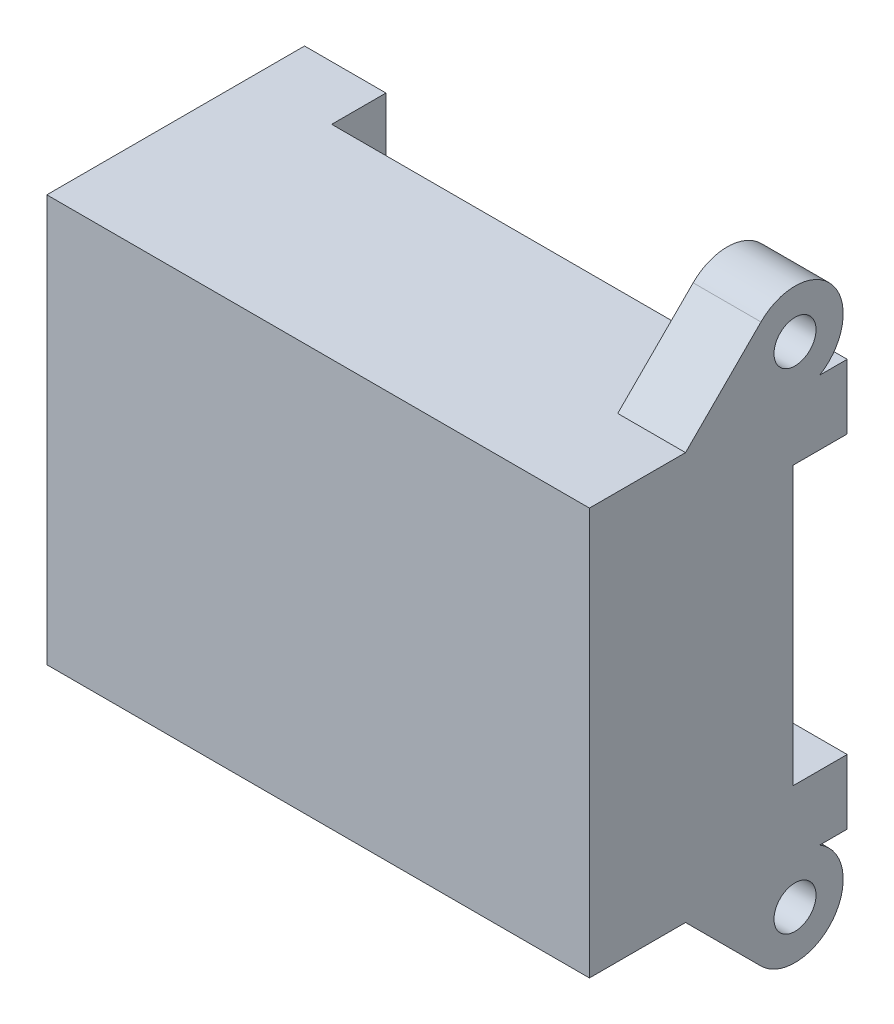
ISO-10303-21;
HEADER;
FILE_DESCRIPTION(('STEP AP214'),'2;1');
FILE_NAME('part.step','',(''),(''),'','','');
FILE_SCHEMA(('AUTOMOTIVE_DESIGN { 1 0 10303 214 1 1 1 1 }'));
ENDSEC;
DATA;
#1=APPLICATION_CONTEXT('core data for automotive mechanical design processes');
#2=APPLICATION_PROTOCOL_DEFINITION('international standard','automotive_design',2000,#1);
#3=PRODUCT_CONTEXT('',#1,'mechanical');
#4=PRODUCT('Part','Part','',(#3));
#5=PRODUCT_RELATED_PRODUCT_CATEGORY('part','',(#4));
#6=PRODUCT_DEFINITION_FORMATION('','',#4);
#7=PRODUCT_DEFINITION_CONTEXT('part definition',#1,'design');
#8=PRODUCT_DEFINITION('design','',#6,#7);
#9=PRODUCT_DEFINITION_SHAPE('','',#8);
#10=(LENGTH_UNIT() NAMED_UNIT(*) SI_UNIT(.MILLI.,.METRE.));
#11=(NAMED_UNIT(*) PLANE_ANGLE_UNIT() SI_UNIT($,.RADIAN.));
#12=(NAMED_UNIT(*) SI_UNIT($,.STERADIAN.) SOLID_ANGLE_UNIT());
#13=UNCERTAINTY_MEASURE_WITH_UNIT(LENGTH_MEASURE(1.E-05),#10,'distance_accuracy_value','');
#14=(GEOMETRIC_REPRESENTATION_CONTEXT(3) GLOBAL_UNCERTAINTY_ASSIGNED_CONTEXT((#13)) GLOBAL_UNIT_ASSIGNED_CONTEXT((#10,
#11,#12)) REPRESENTATION_CONTEXT('',''));
#15=CARTESIAN_POINT('',(0.,0.,0.));
#16=DIRECTION('',(0.,0.,1.));
#17=DIRECTION('',(1.,0.,0.));
#18=AXIS2_PLACEMENT_3D('',#15,#16,#17);
#19=CARTESIAN_POINT('',(-87.5999999999999,0.500000000000004,-14.9999999999999));
#20=DIRECTION('',(0.,0.,-1.));
#21=DIRECTION('',(0.,1.,0.));
#22=AXIS2_PLACEMENT_3D('',#19,#20,#21);
#23=PLANE('',#22);
#24=DIRECTION('',(1.,0.,0.));
#25=VECTOR('',#24,1.);
#26=CARTESIAN_POINT('',(-44.15,-9.73000000000001,-14.9999999999999));
#27=LINE('',#26,#25);
#28=CARTESIAN_POINT('',(-50.15,-9.73000000000001,-14.9999999999999));
#29=VERTEX_POINT('',#28);
#30=CARTESIAN_POINT('',(-44.15,-9.73000000000001,-14.9999999999999));
#31=VERTEX_POINT('',#30);
#32=EDGE_CURVE('E54',#29,#31,#27,.T.);
#33=ORIENTED_EDGE('',*,*,#32,.F.);
#34=DIRECTION('',(0.,1.,0.));
#35=VECTOR('',#34,1.);
#36=CARTESIAN_POINT('',(-50.15,-9.73000000000001,-14.9999999999999));
#37=LINE('',#36,#35);
#38=CARTESIAN_POINT('',(-50.15,-14.5,-14.9999999999999));
#39=VERTEX_POINT('',#38);
#40=EDGE_CURVE('E58',#39,#29,#37,.T.);
#41=ORIENTED_EDGE('',*,*,#40,.F.);
#42=DIRECTION('',(1.,0.,0.));
#43=VECTOR('',#42,1.);
#44=CARTESIAN_POINT('',(-84.15,-14.5,-14.9999999999999));
#45=LINE('',#44,#43);
#46=CARTESIAN_POINT('',(-78.15,-14.5,-14.9999999999999));
#47=VERTEX_POINT('',#46);
#48=EDGE_CURVE('E394',#47,#39,#45,.T.);
#49=ORIENTED_EDGE('',*,*,#48,.F.);
#50=DIRECTION('',(0.,-1.,0.));
#51=VECTOR('',#50,1.);
#52=CARTESIAN_POINT('',(-78.15,-14.5,-14.9999999999999));
#53=LINE('',#52,#51);
#54=CARTESIAN_POINT('',(-78.15,-9.73,-14.9999999999999));
#55=VERTEX_POINT('',#54);
#56=EDGE_CURVE('E231',#55,#47,#53,.T.);
#57=ORIENTED_EDGE('',*,*,#56,.F.);
#58=DIRECTION('',(1.,0.,0.));
#59=VECTOR('',#58,1.);
#60=CARTESIAN_POINT('',(-84.15,-9.73,-14.9999999999999));
#61=LINE('',#60,#59);
#62=CARTESIAN_POINT('',(-84.15,-9.73,-14.9999999999999));
#63=VERTEX_POINT('',#62);
#64=EDGE_CURVE('E220',#63,#55,#61,.T.);
#65=ORIENTED_EDGE('',*,*,#64,.F.);
#66=DIRECTION('',(0.,-1.,0.));
#67=VECTOR('',#66,1.);
#68=CARTESIAN_POINT('',(-84.15,15.5,-14.9999999999999));
#69=LINE('',#68,#67);
#70=CARTESIAN_POINT('',(-84.15,10.73,-14.9999999999999));
#71=VERTEX_POINT('',#70);
#72=EDGE_CURVE('E47',#71,#63,#69,.T.);
#73=ORIENTED_EDGE('',*,*,#72,.F.);
#74=DIRECTION('',(-1.,0.,0.));
#75=VECTOR('',#74,1.);
#76=CARTESIAN_POINT('',(-84.15,10.73,-14.9999999999999));
#77=LINE('',#76,#75);
#78=CARTESIAN_POINT('',(-78.15,10.73,-14.9999999999999));
#79=VERTEX_POINT('',#78);
#80=EDGE_CURVE('E262',#79,#71,#77,.T.);
#81=ORIENTED_EDGE('',*,*,#80,.F.);
#82=DIRECTION('',(0.,-1.,0.));
#83=VECTOR('',#82,1.);
#84=CARTESIAN_POINT('',(-78.15,15.5,-14.9999999999999));
#85=LINE('',#84,#83);
#86=CARTESIAN_POINT('',(-78.15,15.5,-14.9999999999999));
#87=VERTEX_POINT('',#86);
#88=EDGE_CURVE('E256',#87,#79,#85,.T.);
#89=ORIENTED_EDGE('',*,*,#88,.F.);
#90=DIRECTION('',(-1.,0.,0.));
#91=VECTOR('',#90,1.);
#92=CARTESIAN_POINT('',(-84.15,15.5,-14.9999999999999));
#93=LINE('',#92,#91);
#94=CARTESIAN_POINT('',(-50.15,15.5,-14.9999999999999));
#95=VERTEX_POINT('',#94);
#96=EDGE_CURVE('E413',#95,#87,#93,.T.);
#97=ORIENTED_EDGE('',*,*,#96,.F.);
#98=DIRECTION('',(0.,1.,0.));
#99=VECTOR('',#98,1.);
#100=CARTESIAN_POINT('',(-50.15,10.73,-14.9999999999999));
#101=LINE('',#100,#99);
#102=CARTESIAN_POINT('',(-50.15,10.73,-14.9999999999999));
#103=VERTEX_POINT('',#102);
#104=EDGE_CURVE('E292',#103,#95,#101,.T.);
#105=ORIENTED_EDGE('',*,*,#104,.F.);
#106=DIRECTION('',(-1.,0.,0.));
#107=VECTOR('',#106,1.);
#108=CARTESIAN_POINT('',(-44.15,10.73,-14.9999999999999));
#109=LINE('',#108,#107);
#110=CARTESIAN_POINT('',(-44.15,10.73,-14.9999999999999));
#111=VERTEX_POINT('',#110);
#112=EDGE_CURVE('E286',#111,#103,#109,.T.);
#113=ORIENTED_EDGE('',*,*,#112,.F.);
#114=DIRECTION('',(0.,1.,0.));
#115=VECTOR('',#114,1.);
#116=CARTESIAN_POINT('',(-44.15,15.5,-14.9999999999999));
#117=LINE('',#116,#115);
#118=EDGE_CURVE('E418',#31,#111,#117,.T.);
#119=ORIENTED_EDGE('',*,*,#118,.F.);
#120=EDGE_LOOP('',(#33,#41,#49,#57,#65,#73,#81,#89,#97,#105,#113,#119));
#121=FACE_BOUND('',#120,.T.);
#122=ADVANCED_FACE('F39',(#121),#23,.T.);
#123=CARTESIAN_POINT('',(-49.15,-17.55,-15.1549999999999));
#124=DIRECTION('',(1.,0.,0.));
#125=DIRECTION('',(0.,0.,-1.));
#126=AXIS2_PLACEMENT_3D('',#123,#124,#125);
#127=CYLINDRICAL_SURFACE('',#126,3.55);
#128=DIRECTION('',(1.,0.,0.));
#129=VECTOR('',#128,1.);
#130=CARTESIAN_POINT('',(-49.15,-14.5,-16.9715902124584));
#131=LINE('',#130,#129);
#132=CARTESIAN_POINT('',(-44.15,-14.5,-16.9715902124584));
#133=VERTEX_POINT('',#132);
#134=CARTESIAN_POINT('',(-49.15,-14.5,-16.9715902124584));
#135=VERTEX_POINT('',#134);
#136=EDGE_CURVE('E216',#133,#135,#131,.F.);
#137=ORIENTED_EDGE('',*,*,#136,.F.);
#138=CARTESIAN_POINT('',(-44.15,-17.55,-15.1549999999999));
#139=DIRECTION('',(-1.,0.,0.));
#140=DIRECTION('',(0.,0.,-1.));
#141=AXIS2_PLACEMENT_3D('',#138,#139,#140);
#142=CIRCLE('',#141,3.55);
#143=CARTESIAN_POINT('',(-44.15,-20.0602290732122,-12.6447709267876));
#144=VERTEX_POINT('',#143);
#145=EDGE_CURVE('E214',#133,#144,#142,.T.);
#146=ORIENTED_EDGE('',*,*,#145,.T.);
#147=DIRECTION('',(1.,0.,0.));
#148=VECTOR('',#147,1.);
#149=CARTESIAN_POINT('',(-49.15,-20.0602290732122,-12.6447709267876));
#150=LINE('',#149,#148);
#151=CARTESIAN_POINT('',(-49.15,-20.0602290732122,-12.6447709267876));
#152=VERTEX_POINT('',#151);
#153=EDGE_CURVE('E350',#152,#144,#150,.T.);
#154=ORIENTED_EDGE('',*,*,#153,.F.);
#155=CARTESIAN_POINT('',(-49.15,-17.55,-15.1549999999999));
#156=DIRECTION('',(-1.,0.,0.));
#157=DIRECTION('',(0.,0.,-1.));
#158=AXIS2_PLACEMENT_3D('',#155,#156,#157);
#159=CIRCLE('',#158,3.55);
#160=EDGE_CURVE('E335',#135,#152,#159,.T.);
#161=ORIENTED_EDGE('',*,*,#160,.F.);
#162=EDGE_LOOP('',(#137,#146,#154,#161));
#163=FACE_BOUND('',#162,.T.);
#164=ADVANCED_FACE('F504',(#163),#127,.T.);
#165=CARTESIAN_POINT('',(-49.15,1.00000000000005,0.));
#166=DIRECTION('',(1.,0.,0.));
#167=DIRECTION('',(0.,0.,-1.));
#168=AXIS2_PLACEMENT_3D('',#165,#166,#167);
#169=PLANE('',#168);
#170=CARTESIAN_POINT('',(-49.15,-17.55,-15.1549999999999));
#171=DIRECTION('',(-1.,0.,0.));
#172=DIRECTION('',(0.,0.,-1.));
#173=AXIS2_PLACEMENT_3D('',#170,#171,#172);
#174=CIRCLE('',#173,1.55);
#175=CARTESIAN_POINT('',(-49.15,-17.55,-16.7049999999999));
#176=VERTEX_POINT('',#175);
#177=EDGE_CURVE('E338',#176,#176,#174,.T.);
#178=ORIENTED_EDGE('',*,*,#177,.F.);
#179=EDGE_LOOP('',(#178));
#180=FACE_BOUND('',#179,.T.);
#181=DIRECTION('',(0.,0.,1.));
#182=VECTOR('',#181,1.);
#183=CARTESIAN_POINT('',(-49.15,-14.5,0.));
#184=LINE('',#183,#182);
#185=CARTESIAN_POINT('',(-49.15,-14.5,-7.08454185357544));
#186=VERTEX_POINT('',#185);
#187=EDGE_CURVE('E328',#135,#186,#184,.T.);
#188=ORIENTED_EDGE('',*,*,#187,.F.);
#189=ORIENTED_EDGE('',*,*,#160,.T.);
#190=DIRECTION('',(0.,0.707106781186549,0.707106781186546));
#191=VECTOR('',#190,1.);
#192=CARTESIAN_POINT('',(-49.15,-3.20772907321222,4.20772907321228));
#193=LINE('',#192,#191);
#194=EDGE_CURVE('E331',#152,#186,#193,.T.);
#195=ORIENTED_EDGE('',*,*,#194,.T.);
#196=EDGE_LOOP('',(#188,#189,#195));
#197=FACE_BOUND('',#196,.T.);
#198=ADVANCED_FACE('F509',(#180,#197),#169,.F.);
#199=CARTESIAN_POINT('',(-49.15,18.55,-15.1549999999999));
#200=DIRECTION('',(1.,0.,0.));
#201=DIRECTION('',(0.,0.,-1.));
#202=AXIS2_PLACEMENT_3D('',#199,#200,#201);
#203=CYLINDRICAL_SURFACE('',#202,3.55);
#204=CARTESIAN_POINT('',(-44.15,18.55,-15.1549999999999));
#205=DIRECTION('',(1.,0.,0.));
#206=DIRECTION('',(0.,0.,-1.));
#207=AXIS2_PLACEMENT_3D('',#204,#205,#206);
#208=CIRCLE('',#207,3.55);
#209=CARTESIAN_POINT('',(-44.15,15.5,-16.9715902124584));
#210=VERTEX_POINT('',#209);
#211=CARTESIAN_POINT('',(-44.15,21.0602290732123,-12.6447709267876));
#212=VERTEX_POINT('',#211);
#213=EDGE_CURVE('E354',#210,#212,#208,.T.);
#214=ORIENTED_EDGE('',*,*,#213,.F.);
#215=DIRECTION('',(1.,0.,0.));
#216=VECTOR('',#215,1.);
#217=CARTESIAN_POINT('',(-49.15,15.5,-16.9715902124584));
#218=LINE('',#217,#216);
#219=CARTESIAN_POINT('',(-49.15,15.5,-16.9715902124584));
#220=VERTEX_POINT('',#219);
#221=EDGE_CURVE('E323',#210,#220,#218,.F.);
#222=ORIENTED_EDGE('',*,*,#221,.T.);
#223=CARTESIAN_POINT('',(-49.15,18.55,-15.1549999999999));
#224=DIRECTION('',(1.,0.,0.));
#225=DIRECTION('',(0.,0.,-1.));
#226=AXIS2_PLACEMENT_3D('',#223,#224,#225);
#227=CIRCLE('',#226,3.55);
#228=CARTESIAN_POINT('',(-49.15,21.0602290732123,-12.6447709267876));
#229=VERTEX_POINT('',#228);
#230=EDGE_CURVE('E361',#220,#229,#227,.T.);
#231=ORIENTED_EDGE('',*,*,#230,.T.);
#232=DIRECTION('',(1.,0.,0.));
#233=VECTOR('',#232,1.);
#234=CARTESIAN_POINT('',(-49.15,21.0602290732123,-12.6447709267876));
#235=LINE('',#234,#233);
#236=EDGE_CURVE('E373',#229,#212,#235,.T.);
#237=ORIENTED_EDGE('',*,*,#236,.T.);
#238=EDGE_LOOP('',(#214,#222,#231,#237));
#239=FACE_BOUND('',#238,.T.);
#240=ADVANCED_FACE('F515',(#239),#203,.T.);
#241=CARTESIAN_POINT('',(-49.15,0.,0.));
#242=DIRECTION('',(1.,0.,0.));
#243=DIRECTION('',(0.,0.,-1.));
#244=AXIS2_PLACEMENT_3D('',#241,#242,#243);
#245=PLANE('',#244);
#246=CARTESIAN_POINT('',(-49.15,18.55,-15.1549999999999));
#247=DIRECTION('',(1.,0.,0.));
#248=DIRECTION('',(0.,0.,-1.));
#249=AXIS2_PLACEMENT_3D('',#246,#247,#248);
#250=CIRCLE('',#249,1.55);
#251=CARTESIAN_POINT('',(-49.15,18.55,-16.7049999999999));
#252=VERTEX_POINT('',#251);
#253=EDGE_CURVE('E369',#252,#252,#250,.T.);
#254=ORIENTED_EDGE('',*,*,#253,.T.);
#255=EDGE_LOOP('',(#254));
#256=FACE_BOUND('',#255,.T.);
#257=ORIENTED_EDGE('',*,*,#230,.F.);
#258=DIRECTION('',(0.,0.,1.));
#259=VECTOR('',#258,1.);
#260=CARTESIAN_POINT('',(-49.15,15.5,0.));
#261=LINE('',#260,#259);
#262=CARTESIAN_POINT('',(-49.15,15.5,-7.08454185357544));
#263=VERTEX_POINT('',#262);
#264=EDGE_CURVE('E358',#220,#263,#261,.T.);
#265=ORIENTED_EDGE('',*,*,#264,.T.);
#266=DIRECTION('',(0.,-0.707106781186549,0.707106781186546));
#267=VECTOR('',#266,1.);
#268=CARTESIAN_POINT('',(-49.15,4.20772907321226,4.20772907321228));
#269=LINE('',#268,#267);
#270=EDGE_CURVE('E365',#229,#263,#269,.T.);
#271=ORIENTED_EDGE('',*,*,#270,.F.);
#272=EDGE_LOOP('',(#257,#265,#271));
#273=FACE_BOUND('',#272,.T.);
#274=ADVANCED_FACE('F526',(#256,#273),#245,.F.);
#275=CARTESIAN_POINT('',(-84.15,-14.5,-64.9999999999999));
#276=DIRECTION('',(0.,-1.,0.));
#277=DIRECTION('',(1.,0.,0.));
#278=AXIS2_PLACEMENT_3D('',#275,#276,#277);
#279=PLANE('',#278);
#280=ORIENTED_EDGE('',*,*,#187,.T.);
#281=DIRECTION('',(1.,0.,0.));
#282=VECTOR('',#281,1.);
#283=CARTESIAN_POINT('',(-49.15,-14.5,-7.08454185357544));
#284=LINE('',#283,#282);
#285=CARTESIAN_POINT('',(-44.15,-14.5,-7.08454185357544));
#286=VERTEX_POINT('',#285);
#287=EDGE_CURVE('E342',#186,#286,#284,.T.);
#288=ORIENTED_EDGE('',*,*,#287,.T.);
#289=DIRECTION('',(0.,0.,1.));
#290=VECTOR('',#289,1.);
#291=CARTESIAN_POINT('',(-44.15,-14.5,-64.9999999999999));
#292=LINE('',#291,#290);
#293=CARTESIAN_POINT('',(-44.15,-14.5,0.));
#294=VERTEX_POINT('',#293);
#295=EDGE_CURVE('E408',#286,#294,#292,.T.);
#296=ORIENTED_EDGE('',*,*,#295,.T.);
#297=DIRECTION('',(1.,0.,0.));
#298=VECTOR('',#297,1.);
#299=CARTESIAN_POINT('',(-84.15,-14.5,0.));
#300=LINE('',#299,#298);
#301=CARTESIAN_POINT('',(-84.15,-14.5,0.));
#302=VERTEX_POINT('',#301);
#303=EDGE_CURVE('E399',#302,#294,#300,.T.);
#304=ORIENTED_EDGE('',*,*,#303,.F.);
#305=DIRECTION('',(0.,0.,1.));
#306=VECTOR('',#305,1.);
#307=CARTESIAN_POINT('',(-84.15,-14.5,-64.9999999999999));
#308=LINE('',#307,#306);
#309=CARTESIAN_POINT('',(-84.15,-14.5,-18.9999999999999));
#310=VERTEX_POINT('',#309);
#311=EDGE_CURVE('E11',#310,#302,#308,.T.);
#312=ORIENTED_EDGE('',*,*,#311,.F.);
#313=DIRECTION('',(-1.,0.,0.));
#314=VECTOR('',#313,1.);
#315=CARTESIAN_POINT('',(-84.15,-14.5,-18.9999999999999));
#316=LINE('',#315,#314);
#317=CARTESIAN_POINT('',(-78.15,-14.5,-18.9999999999999));
#318=VERTEX_POINT('',#317);
#319=EDGE_CURVE('E237',#318,#310,#316,.T.);
#320=ORIENTED_EDGE('',*,*,#319,.F.);
#321=DIRECTION('',(0.,0.,1.));
#322=VECTOR('',#321,1.);
#323=CARTESIAN_POINT('',(-78.15,-14.5,-18.9999999999999));
#324=LINE('',#323,#322);
#325=EDGE_CURVE('E241',#318,#47,#324,.T.);
#326=ORIENTED_EDGE('',*,*,#325,.T.);
#327=ORIENTED_EDGE('',*,*,#48,.T.);
#328=DIRECTION('',(0.,0.,1.));
#329=VECTOR('',#328,1.);
#330=CARTESIAN_POINT('',(-50.15,-14.5,-18.9999999999999));
#331=LINE('',#330,#329);
#332=CARTESIAN_POINT('',(-50.15,-14.5,-18.9999999999999));
#333=VERTEX_POINT('',#332);
#334=EDGE_CURVE('E194',#333,#39,#331,.T.);
#335=ORIENTED_EDGE('',*,*,#334,.F.);
#336=DIRECTION('',(-1.,0.,0.));
#337=VECTOR('',#336,1.);
#338=CARTESIAN_POINT('',(-44.15,-14.5,-18.9999999999999));
#339=LINE('',#338,#337);
#340=CARTESIAN_POINT('',(-44.15,-14.5,-18.9999999999999));
#341=VERTEX_POINT('',#340);
#342=EDGE_CURVE('E186',#341,#333,#339,.T.);
#343=ORIENTED_EDGE('',*,*,#342,.F.);
#344=DIRECTION('',(0.,0.,1.));
#345=VECTOR('',#344,1.);
#346=CARTESIAN_POINT('',(-44.15,-14.5,-18.9999999999999));
#347=LINE('',#346,#345);
#348=EDGE_CURVE('E192',#341,#133,#347,.T.);
#349=ORIENTED_EDGE('',*,*,#348,.T.);
#350=ORIENTED_EDGE('',*,*,#136,.T.);
#351=EDGE_LOOP('',(#280,#288,#296,#304,#312,#320,#326,#327,#335,#343,#349,#350));
#352=FACE_BOUND('',#351,.T.);
#353=ADVANCED_FACE('F189',(#352),#279,.T.);
#354=CARTESIAN_POINT('',(0.,0.,0.));
#355=DIRECTION('',(0.,0.,1.));
#356=DIRECTION('',(1.,0.,0.));
#357=AXIS2_PLACEMENT_3D('',#354,#355,#356);
#358=PLANE('',#357);
#359=DIRECTION('',(0.,-1.,0.));
#360=VECTOR('',#359,1.);
#361=CARTESIAN_POINT('',(-84.15,15.5,0.));
#362=LINE('',#361,#360);
#363=CARTESIAN_POINT('',(-84.15,15.5,0.));
#364=VERTEX_POINT('',#363);
#365=EDGE_CURVE('E386',#364,#302,#362,.T.);
#366=ORIENTED_EDGE('',*,*,#365,.T.);
#367=ORIENTED_EDGE('',*,*,#303,.T.);
#368=DIRECTION('',(0.,1.,0.));
#369=VECTOR('',#368,1.);
#370=CARTESIAN_POINT('',(-44.15,15.5,0.));
#371=LINE('',#370,#369);
#372=CARTESIAN_POINT('',(-44.15,15.5,0.));
#373=VERTEX_POINT('',#372);
#374=EDGE_CURVE('E395',#294,#373,#371,.T.);
#375=ORIENTED_EDGE('',*,*,#374,.T.);
#376=DIRECTION('',(-1.,0.,0.));
#377=VECTOR('',#376,1.);
#378=CARTESIAN_POINT('',(-84.15,15.5,0.));
#379=LINE('',#378,#377);
#380=EDGE_CURVE('E390',#373,#364,#379,.T.);
#381=ORIENTED_EDGE('',*,*,#380,.T.);
#382=EDGE_LOOP('',(#366,#367,#375,#381));
#383=FACE_BOUND('',#382,.T.);
#384=ADVANCED_FACE('F432',(#383),#358,.T.);
#385=CARTESIAN_POINT('',(-44.15,15.5,-64.9999999999999));
#386=DIRECTION('',(1.,0.,0.));
#387=DIRECTION('',(0.,0.,-1.));
#388=AXIS2_PLACEMENT_3D('',#385,#386,#387);
#389=PLANE('',#388);
#390=ORIENTED_EDGE('',*,*,#145,.F.);
#391=ORIENTED_EDGE('',*,*,#348,.F.);
#392=DIRECTION('',(0.,-1.,0.));
#393=VECTOR('',#392,1.);
#394=CARTESIAN_POINT('',(-44.15,-9.73000000000001,-18.9999999999999));
#395=LINE('',#394,#393);
#396=CARTESIAN_POINT('',(-44.15,-9.73000000000001,-18.9999999999999));
#397=VERTEX_POINT('',#396);
#398=EDGE_CURVE('E199',#397,#341,#395,.T.);
#399=ORIENTED_EDGE('',*,*,#398,.F.);
#400=DIRECTION('',(0.,0.,1.));
#401=VECTOR('',#400,1.);
#402=CARTESIAN_POINT('',(-44.15,-9.73000000000001,-18.9999999999999));
#403=LINE('',#402,#401);
#404=EDGE_CURVE('E477',#397,#31,#403,.T.);
#405=ORIENTED_EDGE('',*,*,#404,.T.);
#406=ORIENTED_EDGE('',*,*,#118,.T.);
#407=DIRECTION('',(0.,0.,1.));
#408=VECTOR('',#407,1.);
#409=CARTESIAN_POINT('',(-44.15,10.73,-18.9999999999999));
#410=LINE('',#409,#408);
#411=CARTESIAN_POINT('',(-44.15,10.73,-18.9999999999999));
#412=VERTEX_POINT('',#411);
#413=EDGE_CURVE('E319',#412,#111,#410,.T.);
#414=ORIENTED_EDGE('',*,*,#413,.F.);
#415=DIRECTION('',(0.,-1.,0.));
#416=VECTOR('',#415,1.);
#417=CARTESIAN_POINT('',(-44.15,10.73,-18.9999999999999));
#418=LINE('',#417,#416);
#419=CARTESIAN_POINT('',(-44.15,15.5,-18.9999999999999));
#420=VERTEX_POINT('',#419);
#421=EDGE_CURVE('E287',#420,#412,#418,.T.);
#422=ORIENTED_EDGE('',*,*,#421,.F.);
#423=DIRECTION('',(0.,0.,1.));
#424=VECTOR('',#423,1.);
#425=CARTESIAN_POINT('',(-44.15,15.5,-18.9999999999999));
#426=LINE('',#425,#424);
#427=EDGE_CURVE('E301',#420,#210,#426,.T.);
#428=ORIENTED_EDGE('',*,*,#427,.T.);
#429=ORIENTED_EDGE('',*,*,#213,.T.);
#430=DIRECTION('',(0.,-0.707106781186549,0.707106781186546));
#431=VECTOR('',#430,1.);
#432=CARTESIAN_POINT('',(-44.15,4.20772907321226,4.20772907321228));
#433=LINE('',#432,#431);
#434=CARTESIAN_POINT('',(-44.15,15.5,-7.08454185357544));
#435=VERTEX_POINT('',#434);
#436=EDGE_CURVE('E376',#212,#435,#433,.T.);
#437=ORIENTED_EDGE('',*,*,#436,.T.);
#438=DIRECTION('',(0.,0.,1.));
#439=VECTOR('',#438,1.);
#440=CARTESIAN_POINT('',(-44.15,15.5,-64.9999999999999));
#441=LINE('',#440,#439);
#442=EDGE_CURVE('E417',#435,#373,#441,.T.);
#443=ORIENTED_EDGE('',*,*,#442,.T.);
#444=ORIENTED_EDGE('',*,*,#374,.F.);
#445=ORIENTED_EDGE('',*,*,#295,.F.);
#446=DIRECTION('',(0.,0.707106781186549,0.707106781186546));
#447=VECTOR('',#446,1.);
#448=CARTESIAN_POINT('',(-44.15,-3.20772907321222,4.20772907321228));
#449=LINE('',#448,#447);
#450=EDGE_CURVE('E327',#144,#286,#449,.T.);
#451=ORIENTED_EDGE('',*,*,#450,.F.);
#452=EDGE_LOOP('',(#390,#391,#399,#405,#406,#414,#422,#428,#429,#437,#443,#444,#445,#451));
#453=FACE_BOUND('',#452,.T.);
#454=CARTESIAN_POINT('',(-44.15,18.55,-15.1549999999999));
#455=DIRECTION('',(1.,0.,0.));
#456=DIRECTION('',(0.,0.,-1.));
#457=AXIS2_PLACEMENT_3D('',#454,#455,#456);
#458=CIRCLE('',#457,1.55);
#459=CARTESIAN_POINT('',(-44.15,18.55,-16.7049999999999));
#460=VERTEX_POINT('',#459);
#461=EDGE_CURVE('E362',#460,#460,#458,.T.);
#462=ORIENTED_EDGE('',*,*,#461,.F.);
#463=EDGE_LOOP('',(#462));
#464=FACE_BOUND('',#463,.T.);
#465=CARTESIAN_POINT('',(-44.15,-17.55,-15.1549999999999));
#466=DIRECTION('',(-1.,0.,0.));
#467=DIRECTION('',(0.,0.,-1.));
#468=AXIS2_PLACEMENT_3D('',#465,#466,#467);
#469=CIRCLE('',#468,1.55);
#470=CARTESIAN_POINT('',(-44.15,-17.55,-16.7049999999999));
#471=VERTEX_POINT('',#470);
#472=EDGE_CURVE('E332',#471,#471,#469,.T.);
#473=ORIENTED_EDGE('',*,*,#472,.T.);
#474=EDGE_LOOP('',(#473));
#475=FACE_BOUND('',#474,.T.);
#476=ADVANCED_FACE('F211',(#453,#464,#475),#389,.T.);
#477=CARTESIAN_POINT('',(-84.15,15.5,-64.9999999999999));
#478=DIRECTION('',(0.,1.,0.));
#479=DIRECTION('',(-1.,0.,0.));
#480=AXIS2_PLACEMENT_3D('',#477,#478,#479);
#481=PLANE('',#480);
#482=DIRECTION('',(1.,0.,0.));
#483=VECTOR('',#482,1.);
#484=CARTESIAN_POINT('',(-49.15,15.5,-7.08454185357544));
#485=LINE('',#484,#483);
#486=EDGE_CURVE('E382',#263,#435,#485,.T.);
#487=ORIENTED_EDGE('',*,*,#486,.F.);
#488=ORIENTED_EDGE('',*,*,#264,.F.);
#489=ORIENTED_EDGE('',*,*,#221,.F.);
#490=ORIENTED_EDGE('',*,*,#427,.F.);
#491=DIRECTION('',(1.,0.,0.));
#492=VECTOR('',#491,1.);
#493=CARTESIAN_POINT('',(-44.15,15.5,-18.9999999999999));
#494=LINE('',#493,#492);
#495=CARTESIAN_POINT('',(-50.15,15.5,-18.9999999999999));
#496=VERTEX_POINT('',#495);
#497=EDGE_CURVE('E298',#496,#420,#494,.T.);
#498=ORIENTED_EDGE('',*,*,#497,.F.);
#499=DIRECTION('',(0.,0.,1.));
#500=VECTOR('',#499,1.);
#501=CARTESIAN_POINT('',(-50.15,15.5,-18.9999999999999));
#502=LINE('',#501,#500);
#503=EDGE_CURVE('E311',#496,#95,#502,.T.);
#504=ORIENTED_EDGE('',*,*,#503,.T.);
#505=ORIENTED_EDGE('',*,*,#96,.T.);
#506=DIRECTION('',(0.,0.,1.));
#507=VECTOR('',#506,1.);
#508=CARTESIAN_POINT('',(-78.15,15.5,-18.9999999999999));
#509=LINE('',#508,#507);
#510=CARTESIAN_POINT('',(-78.15,15.5,-18.9999999999999));
#511=VERTEX_POINT('',#510);
#512=EDGE_CURVE('E283',#511,#87,#509,.T.);
#513=ORIENTED_EDGE('',*,*,#512,.F.);
#514=DIRECTION('',(1.,0.,0.));
#515=VECTOR('',#514,1.);
#516=CARTESIAN_POINT('',(-84.15,15.5,-18.9999999999999));
#517=LINE('',#516,#515);
#518=CARTESIAN_POINT('',(-84.15,15.5,-18.9999999999999));
#519=VERTEX_POINT('',#518);
#520=EDGE_CURVE('E261',#519,#511,#517,.T.);
#521=ORIENTED_EDGE('',*,*,#520,.F.);
#522=DIRECTION('',(0.,0.,1.));
#523=VECTOR('',#522,1.);
#524=CARTESIAN_POINT('',(-84.15,15.5,-64.9999999999999));
#525=LINE('',#524,#523);
#526=EDGE_CURVE('E412',#519,#364,#525,.T.);
#527=ORIENTED_EDGE('',*,*,#526,.T.);
#528=ORIENTED_EDGE('',*,*,#380,.F.);
#529=ORIENTED_EDGE('',*,*,#442,.F.);
#530=EDGE_LOOP('',(#487,#488,#489,#490,#498,#504,#505,#513,#521,#527,#528,#529));
#531=FACE_BOUND('',#530,.T.);
#532=ADVANCED_FACE('F463',(#531),#481,.T.);
#533=CARTESIAN_POINT('',(-84.15,15.5,-64.9999999999999));
#534=DIRECTION('',(-1.,0.,0.));
#535=DIRECTION('',(0.,0.,1.));
#536=AXIS2_PLACEMENT_3D('',#533,#534,#535);
#537=PLANE('',#536);
#538=ORIENTED_EDGE('',*,*,#526,.F.);
#539=DIRECTION('',(0.,1.,0.));
#540=VECTOR('',#539,1.);
#541=CARTESIAN_POINT('',(-84.15,15.5,-18.9999999999999));
#542=LINE('',#541,#540);
#543=CARTESIAN_POINT('',(-84.15,10.73,-18.9999999999999));
#544=VERTEX_POINT('',#543);
#545=EDGE_CURVE('E257',#544,#519,#542,.T.);
#546=ORIENTED_EDGE('',*,*,#545,.F.);
#547=DIRECTION('',(0.,0.,1.));
#548=VECTOR('',#547,1.);
#549=CARTESIAN_POINT('',(-84.15,10.73,-18.9999999999999));
#550=LINE('',#549,#548);
#551=EDGE_CURVE('E271',#544,#71,#550,.T.);
#552=ORIENTED_EDGE('',*,*,#551,.T.);
#553=ORIENTED_EDGE('',*,*,#72,.T.);
#554=DIRECTION('',(0.,0.,1.));
#555=VECTOR('',#554,1.);
#556=CARTESIAN_POINT('',(-84.15,-9.73,-18.9999999999999));
#557=LINE('',#556,#555);
#558=CARTESIAN_POINT('',(-84.15,-9.73,-18.9999999999999));
#559=VERTEX_POINT('',#558);
#560=EDGE_CURVE('E253',#559,#63,#557,.T.);
#561=ORIENTED_EDGE('',*,*,#560,.F.);
#562=DIRECTION('',(0.,1.,0.));
#563=VECTOR('',#562,1.);
#564=CARTESIAN_POINT('',(-84.15,-14.5,-18.9999999999999));
#565=LINE('',#564,#563);
#566=EDGE_CURVE('E226',#310,#559,#565,.T.);
#567=ORIENTED_EDGE('',*,*,#566,.F.);
#568=ORIENTED_EDGE('',*,*,#311,.T.);
#569=ORIENTED_EDGE('',*,*,#365,.F.);
#570=EDGE_LOOP('',(#538,#546,#552,#553,#561,#567,#568,#569));
#571=FACE_BOUND('',#570,.T.);
#572=ADVANCED_FACE('F435',(#571),#537,.T.);
#573=CARTESIAN_POINT('',(-49.15,4.20772907321226,4.20772907321228));
#574=DIRECTION('',(0.,0.707106781186546,0.707106781186549));
#575=DIRECTION('',(0.,-0.707106781186549,0.707106781186546));
#576=AXIS2_PLACEMENT_3D('',#573,#574,#575);
#577=PLANE('',#576);
#578=ORIENTED_EDGE('',*,*,#436,.F.);
#579=ORIENTED_EDGE('',*,*,#236,.F.);
#580=ORIENTED_EDGE('',*,*,#270,.T.);
#581=ORIENTED_EDGE('',*,*,#486,.T.);
#582=EDGE_LOOP('',(#578,#579,#580,#581));
#583=FACE_BOUND('',#582,.T.);
#584=ADVANCED_FACE('F532',(#583),#577,.T.);
#585=CARTESIAN_POINT('',(-49.15,18.55,-15.1549999999999));
#586=DIRECTION('',(1.,0.,0.));
#587=DIRECTION('',(0.,0.,-1.));
#588=AXIS2_PLACEMENT_3D('',#585,#586,#587);
#589=CYLINDRICAL_SURFACE('',#588,1.55);
#590=ORIENTED_EDGE('',*,*,#253,.F.);
#591=EDGE_LOOP('',(#590));
#592=FACE_BOUND('',#591,.T.);
#593=ORIENTED_EDGE('',*,*,#461,.T.);
#594=EDGE_LOOP('',(#593));
#595=FACE_BOUND('',#594,.T.);
#596=ADVANCED_FACE('F524',(#592,#595),#589,.F.);
#597=CARTESIAN_POINT('',(-49.15,-3.20772907321222,4.20772907321228));
#598=DIRECTION('',(0.,0.707106781186546,-0.707106781186549));
#599=DIRECTION('',(0.,0.707106781186549,0.707106781186546));
#600=AXIS2_PLACEMENT_3D('',#597,#598,#599);
#601=PLANE('',#600);
#602=ORIENTED_EDGE('',*,*,#450,.T.);
#603=ORIENTED_EDGE('',*,*,#287,.F.);
#604=ORIENTED_EDGE('',*,*,#194,.F.);
#605=ORIENTED_EDGE('',*,*,#153,.T.);
#606=EDGE_LOOP('',(#602,#603,#604,#605));
#607=FACE_BOUND('',#606,.T.);
#608=ADVANCED_FACE('F521',(#607),#601,.F.);
#609=CARTESIAN_POINT('',(-49.15,-17.55,-15.1549999999999));
#610=DIRECTION('',(1.,0.,0.));
#611=DIRECTION('',(0.,0.,-1.));
#612=AXIS2_PLACEMENT_3D('',#609,#610,#611);
#613=CYLINDRICAL_SURFACE('',#612,1.55);
#614=ORIENTED_EDGE('',*,*,#177,.T.);
#615=EDGE_LOOP('',(#614));
#616=FACE_BOUND('',#615,.T.);
#617=ORIENTED_EDGE('',*,*,#472,.F.);
#618=EDGE_LOOP('',(#617));
#619=FACE_BOUND('',#618,.T.);
#620=ADVANCED_FACE('F520',(#616,#619),#613,.F.);
#621=CARTESIAN_POINT('',(-44.15,10.73,-18.9999999999999));
#622=DIRECTION('',(0.,1.,0.));
#623=DIRECTION('',(0.,0.,1.));
#624=AXIS2_PLACEMENT_3D('',#621,#622,#623);
#625=PLANE('',#624);
#626=ORIENTED_EDGE('',*,*,#112,.T.);
#627=DIRECTION('',(0.,0.,1.));
#628=VECTOR('',#627,1.);
#629=CARTESIAN_POINT('',(-50.15,10.73,-18.9999999999999));
#630=LINE('',#629,#628);
#631=CARTESIAN_POINT('',(-50.15,10.73,-18.9999999999999));
#632=VERTEX_POINT('',#631);
#633=EDGE_CURVE('E315',#632,#103,#630,.T.);
#634=ORIENTED_EDGE('',*,*,#633,.F.);
#635=DIRECTION('',(-1.,0.,0.));
#636=VECTOR('',#635,1.);
#637=CARTESIAN_POINT('',(-44.15,10.73,-18.9999999999999));
#638=LINE('',#637,#636);
#639=EDGE_CURVE('E291',#412,#632,#638,.T.);
#640=ORIENTED_EDGE('',*,*,#639,.F.);
#641=ORIENTED_EDGE('',*,*,#413,.T.);
#642=EDGE_LOOP('',(#626,#634,#640,#641));
#643=FACE_BOUND('',#642,.T.);
#644=ADVANCED_FACE('F474',(#643),#625,.F.);
#645=CARTESIAN_POINT('',(-50.15,10.73,-18.9999999999999));
#646=DIRECTION('',(1.,0.,0.));
#647=DIRECTION('',(0.,0.,-1.));
#648=AXIS2_PLACEMENT_3D('',#645,#646,#647);
#649=PLANE('',#648);
#650=ORIENTED_EDGE('',*,*,#104,.T.);
#651=ORIENTED_EDGE('',*,*,#503,.F.);
#652=DIRECTION('',(0.,1.,0.));
#653=VECTOR('',#652,1.);
#654=CARTESIAN_POINT('',(-50.15,10.73,-18.9999999999999));
#655=LINE('',#654,#653);
#656=EDGE_CURVE('E295',#632,#496,#655,.T.);
#657=ORIENTED_EDGE('',*,*,#656,.F.);
#658=ORIENTED_EDGE('',*,*,#633,.T.);
#659=EDGE_LOOP('',(#650,#651,#657,#658));
#660=FACE_BOUND('',#659,.T.);
#661=ADVANCED_FACE('F470',(#660),#649,.F.);
#662=CARTESIAN_POINT('',(0.,0.,-18.9999999999999));
#663=DIRECTION('',(0.,0.,1.));
#664=DIRECTION('',(1.,0.,0.));
#665=AXIS2_PLACEMENT_3D('',#662,#663,#664);
#666=PLANE('',#665);
#667=ORIENTED_EDGE('',*,*,#421,.T.);
#668=ORIENTED_EDGE('',*,*,#639,.T.);
#669=ORIENTED_EDGE('',*,*,#656,.T.);
#670=ORIENTED_EDGE('',*,*,#497,.T.);
#671=EDGE_LOOP('',(#667,#668,#669,#670));
#672=FACE_BOUND('',#671,.T.);
#673=ADVANCED_FACE('F577',(#672),#666,.F.);
#674=CARTESIAN_POINT('',(-78.15,15.5,-18.9999999999999));
#675=DIRECTION('',(-1.,0.,0.));
#676=DIRECTION('',(0.,0.,1.));
#677=AXIS2_PLACEMENT_3D('',#674,#675,#676);
#678=PLANE('',#677);
#679=ORIENTED_EDGE('',*,*,#88,.T.);
#680=DIRECTION('',(0.,0.,1.));
#681=VECTOR('',#680,1.);
#682=CARTESIAN_POINT('',(-78.15,10.73,-18.9999999999999));
#683=LINE('',#682,#681);
#684=CARTESIAN_POINT('',(-78.15,10.73,-18.9999999999999));
#685=VERTEX_POINT('',#684);
#686=EDGE_CURVE('E279',#685,#79,#683,.T.);
#687=ORIENTED_EDGE('',*,*,#686,.F.);
#688=DIRECTION('',(0.,-1.,0.));
#689=VECTOR('',#688,1.);
#690=CARTESIAN_POINT('',(-78.15,15.5,-18.9999999999999));
#691=LINE('',#690,#689);
#692=EDGE_CURVE('E265',#511,#685,#691,.T.);
#693=ORIENTED_EDGE('',*,*,#692,.F.);
#694=ORIENTED_EDGE('',*,*,#512,.T.);
#695=EDGE_LOOP('',(#679,#687,#693,#694));
#696=FACE_BOUND('',#695,.T.);
#697=ADVANCED_FACE('F584',(#696),#678,.F.);
#698=CARTESIAN_POINT('',(-84.15,10.73,-18.9999999999999));
#699=DIRECTION('',(0.,1.,0.));
#700=DIRECTION('',(0.,0.,1.));
#701=AXIS2_PLACEMENT_3D('',#698,#699,#700);
#702=PLANE('',#701);
#703=ORIENTED_EDGE('',*,*,#80,.T.);
#704=ORIENTED_EDGE('',*,*,#551,.F.);
#705=DIRECTION('',(-1.,0.,0.));
#706=VECTOR('',#705,1.);
#707=CARTESIAN_POINT('',(-84.15,10.73,-18.9999999999999));
#708=LINE('',#707,#706);
#709=EDGE_CURVE('E268',#685,#544,#708,.T.);
#710=ORIENTED_EDGE('',*,*,#709,.F.);
#711=ORIENTED_EDGE('',*,*,#686,.T.);
#712=EDGE_LOOP('',(#703,#704,#710,#711));
#713=FACE_BOUND('',#712,.T.);
#714=ADVANCED_FACE('F456',(#713),#702,.F.);
#715=CARTESIAN_POINT('',(0.,0.,-18.9999999999999));
#716=DIRECTION('',(0.,0.,1.));
#717=DIRECTION('',(1.,0.,0.));
#718=AXIS2_PLACEMENT_3D('',#715,#716,#717);
#719=PLANE('',#718);
#720=ORIENTED_EDGE('',*,*,#545,.T.);
#721=ORIENTED_EDGE('',*,*,#520,.T.);
#722=ORIENTED_EDGE('',*,*,#692,.T.);
#723=ORIENTED_EDGE('',*,*,#709,.T.);
#724=EDGE_LOOP('',(#720,#721,#722,#723));
#725=FACE_BOUND('',#724,.T.);
#726=ADVANCED_FACE('F598',(#725),#719,.F.);
#727=CARTESIAN_POINT('',(-84.15,-9.73,-18.9999999999999));
#728=DIRECTION('',(0.,-1.,0.));
#729=DIRECTION('',(0.,0.,-1.));
#730=AXIS2_PLACEMENT_3D('',#727,#728,#729);
#731=PLANE('',#730);
#732=ORIENTED_EDGE('',*,*,#64,.T.);
#733=DIRECTION('',(0.,0.,1.));
#734=VECTOR('',#733,1.);
#735=CARTESIAN_POINT('',(-78.15,-9.73,-18.9999999999999));
#736=LINE('',#735,#734);
#737=CARTESIAN_POINT('',(-78.15,-9.73,-18.9999999999999));
#738=VERTEX_POINT('',#737);
#739=EDGE_CURVE('E249',#738,#55,#736,.T.);
#740=ORIENTED_EDGE('',*,*,#739,.F.);
#741=DIRECTION('',(1.,0.,0.));
#742=VECTOR('',#741,1.);
#743=CARTESIAN_POINT('',(-84.15,-9.73,-18.9999999999999));
#744=LINE('',#743,#742);
#745=EDGE_CURVE('E230',#559,#738,#744,.T.);
#746=ORIENTED_EDGE('',*,*,#745,.F.);
#747=ORIENTED_EDGE('',*,*,#560,.T.);
#748=EDGE_LOOP('',(#732,#740,#746,#747));
#749=FACE_BOUND('',#748,.T.);
#750=ADVANCED_FACE('F605',(#749),#731,.F.);
#751=CARTESIAN_POINT('',(-78.15,-14.5,-18.9999999999999));
#752=DIRECTION('',(-1.,0.,0.));
#753=DIRECTION('',(0.,0.,1.));
#754=AXIS2_PLACEMENT_3D('',#751,#752,#753);
#755=PLANE('',#754);
#756=ORIENTED_EDGE('',*,*,#56,.T.);
#757=ORIENTED_EDGE('',*,*,#325,.F.);
#758=DIRECTION('',(0.,-1.,0.));
#759=VECTOR('',#758,1.);
#760=CARTESIAN_POINT('',(-78.15,-14.5,-18.9999999999999));
#761=LINE('',#760,#759);
#762=EDGE_CURVE('E234',#738,#318,#761,.T.);
#763=ORIENTED_EDGE('',*,*,#762,.F.);
#764=ORIENTED_EDGE('',*,*,#739,.T.);
#765=EDGE_LOOP('',(#756,#757,#763,#764));
#766=FACE_BOUND('',#765,.T.);
#767=ADVANCED_FACE('F447',(#766),#755,.F.);
#768=CARTESIAN_POINT('',(0.,0.,-18.9999999999999));
#769=DIRECTION('',(0.,0.,-1.));
#770=DIRECTION('',(-1.,0.,0.));
#771=AXIS2_PLACEMENT_3D('',#768,#769,#770);
#772=PLANE('',#771);
#773=ORIENTED_EDGE('',*,*,#566,.T.);
#774=ORIENTED_EDGE('',*,*,#745,.T.);
#775=ORIENTED_EDGE('',*,*,#762,.T.);
#776=ORIENTED_EDGE('',*,*,#319,.T.);
#777=EDGE_LOOP('',(#773,#774,#775,#776));
#778=FACE_BOUND('',#777,.T.);
#779=ADVANCED_FACE('F442',(#778),#772,.T.);
#780=CARTESIAN_POINT('',(-50.15,-9.73000000000001,-18.9999999999999));
#781=DIRECTION('',(1.,0.,0.));
#782=DIRECTION('',(0.,0.,-1.));
#783=AXIS2_PLACEMENT_3D('',#780,#781,#782);
#784=PLANE('',#783);
#785=ORIENTED_EDGE('',*,*,#40,.T.);
#786=DIRECTION('',(0.,0.,1.));
#787=VECTOR('',#786,1.);
#788=CARTESIAN_POINT('',(-50.15,-9.73000000000001,-18.9999999999999));
#789=LINE('',#788,#787);
#790=CARTESIAN_POINT('',(-50.15,-9.73000000000001,-18.9999999999999));
#791=VERTEX_POINT('',#790);
#792=EDGE_CURVE('E222',#791,#29,#789,.T.);
#793=ORIENTED_EDGE('',*,*,#792,.F.);
#794=DIRECTION('',(0.,1.,0.));
#795=VECTOR('',#794,1.);
#796=CARTESIAN_POINT('',(-50.15,-9.73000000000001,-18.9999999999999));
#797=LINE('',#796,#795);
#798=EDGE_CURVE('E198',#333,#791,#797,.T.);
#799=ORIENTED_EDGE('',*,*,#798,.F.);
#800=ORIENTED_EDGE('',*,*,#334,.T.);
#801=EDGE_LOOP('',(#785,#793,#799,#800));
#802=FACE_BOUND('',#801,.T.);
#803=ADVANCED_FACE('F494',(#802),#784,.F.);
#804=CARTESIAN_POINT('',(-44.15,-9.73000000000001,-18.9999999999999));
#805=DIRECTION('',(0.,-1.,0.));
#806=DIRECTION('',(0.,0.,-1.));
#807=AXIS2_PLACEMENT_3D('',#804,#805,#806);
#808=PLANE('',#807);
#809=ORIENTED_EDGE('',*,*,#32,.T.);
#810=ORIENTED_EDGE('',*,*,#404,.F.);
#811=DIRECTION('',(1.,0.,0.));
#812=VECTOR('',#811,1.);
#813=CARTESIAN_POINT('',(-44.15,-9.73000000000001,-18.9999999999999));
#814=LINE('',#813,#812);
#815=EDGE_CURVE('E204',#791,#397,#814,.T.);
#816=ORIENTED_EDGE('',*,*,#815,.F.);
#817=ORIENTED_EDGE('',*,*,#792,.T.);
#818=EDGE_LOOP('',(#809,#810,#816,#817));
#819=FACE_BOUND('',#818,.T.);
#820=ADVANCED_FACE('F480',(#819),#808,.F.);
#821=CARTESIAN_POINT('',(0.,0.,-18.9999999999999));
#822=DIRECTION('',(0.,0.,-1.));
#823=DIRECTION('',(-1.,0.,0.));
#824=AXIS2_PLACEMENT_3D('',#821,#822,#823);
#825=PLANE('',#824);
#826=ORIENTED_EDGE('',*,*,#398,.T.);
#827=ORIENTED_EDGE('',*,*,#342,.T.);
#828=ORIENTED_EDGE('',*,*,#798,.T.);
#829=ORIENTED_EDGE('',*,*,#815,.T.);
#830=EDGE_LOOP('',(#826,#827,#828,#829));
#831=FACE_BOUND('',#830,.T.);
#832=ADVANCED_FACE('F202',(#831),#825,.T.);
#833=CLOSED_SHELL('',(#122,#164,#198,#240,#274,#353,#384,#476,#532,#572,#584,#596,#608,#620,
#644,#661,#673,#697,#714,#726,#750,#767,#779,#803,#820,#832));
#834=MANIFOLD_SOLID_BREP('B2',#833);
#835=ADVANCED_BREP_SHAPE_REPRESENTATION('',(#18,#834),#14);
#836=SHAPE_DEFINITION_REPRESENTATION(#9,#835);
ENDSEC;
END-ISO-10303-21;
